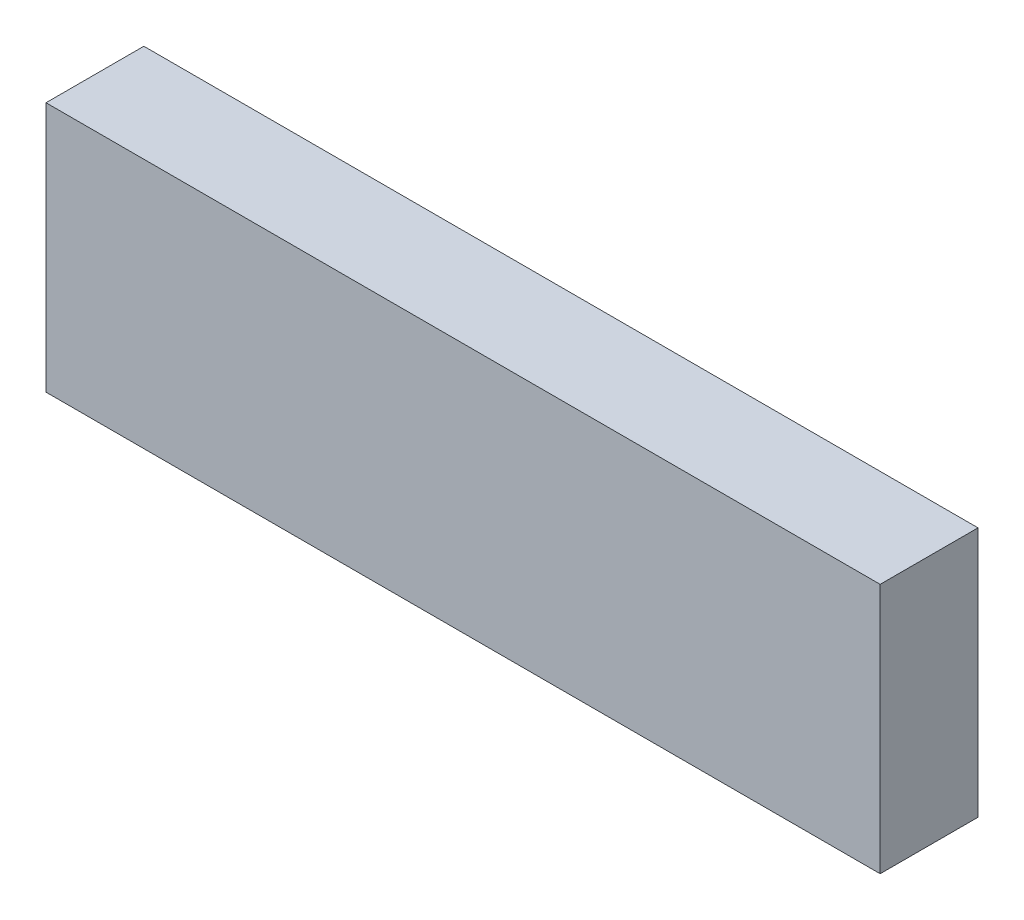
ISO-10303-21;
HEADER;
FILE_DESCRIPTION(('STEP AP214'),'2;1');
FILE_NAME('part.step','',(''),(''),'','','');
FILE_SCHEMA(('AUTOMOTIVE_DESIGN { 1 0 10303 214 1 1 1 1 }'));
ENDSEC;
DATA;
#1=APPLICATION_CONTEXT('core data for automotive mechanical design processes');
#2=APPLICATION_PROTOCOL_DEFINITION('international standard','automotive_design',2000,#1);
#3=PRODUCT_CONTEXT('',#1,'mechanical');
#4=PRODUCT('Part','Part','',(#3));
#5=PRODUCT_RELATED_PRODUCT_CATEGORY('part','',(#4));
#6=PRODUCT_DEFINITION_FORMATION('','',#4);
#7=PRODUCT_DEFINITION_CONTEXT('part definition',#1,'design');
#8=PRODUCT_DEFINITION('design','',#6,#7);
#9=PRODUCT_DEFINITION_SHAPE('','',#8);
#10=(LENGTH_UNIT() NAMED_UNIT(*) SI_UNIT(.MILLI.,.METRE.));
#11=(NAMED_UNIT(*) PLANE_ANGLE_UNIT() SI_UNIT($,.RADIAN.));
#12=(NAMED_UNIT(*) SI_UNIT($,.STERADIAN.) SOLID_ANGLE_UNIT());
#13=UNCERTAINTY_MEASURE_WITH_UNIT(LENGTH_MEASURE(1.E-05),#10,'distance_accuracy_value','');
#14=(GEOMETRIC_REPRESENTATION_CONTEXT(3) GLOBAL_UNCERTAINTY_ASSIGNED_CONTEXT((#13)) GLOBAL_UNIT_ASSIGNED_CONTEXT((#10,
#11,#12)) REPRESENTATION_CONTEXT('',''));
#15=CARTESIAN_POINT('',(0.,0.,0.));
#16=DIRECTION('',(0.,0.,1.));
#17=DIRECTION('',(1.,0.,0.));
#18=AXIS2_PLACEMENT_3D('',#15,#16,#17);
#19=CARTESIAN_POINT('',(-20.3,12.2,4.7625));
#20=DIRECTION('',(1.,0.,0.));
#21=DIRECTION('',(0.,0.,-1.));
#22=AXIS2_PLACEMENT_3D('',#19,#20,#21);
#23=PLANE('',#22);
#24=DIRECTION('',(0.,-1.,0.));
#25=VECTOR('',#24,1.);
#26=CARTESIAN_POINT('',(-20.3,12.2,0.));
#27=LINE('',#26,#25);
#28=CARTESIAN_POINT('',(-20.3,12.2,0.));
#29=VERTEX_POINT('',#28);
#30=CARTESIAN_POINT('',(-20.3,0.,0.));
#31=VERTEX_POINT('',#30);
#32=EDGE_CURVE('E96',#29,#31,#27,.T.);
#33=ORIENTED_EDGE('',*,*,#32,.T.);
#34=DIRECTION('',(0.,0.,-1.));
#35=VECTOR('',#34,1.);
#36=CARTESIAN_POINT('',(-20.3,0.,4.7625));
#37=LINE('',#36,#35);
#38=CARTESIAN_POINT('',(-20.3,0.,4.7625));
#39=VERTEX_POINT('',#38);
#40=EDGE_CURVE('E11',#39,#31,#37,.T.);
#41=ORIENTED_EDGE('',*,*,#40,.F.);
#42=DIRECTION('',(0.,-1.,0.));
#43=VECTOR('',#42,1.);
#44=CARTESIAN_POINT('',(-20.3,12.2,4.7625));
#45=LINE('',#44,#43);
#46=CARTESIAN_POINT('',(-20.3,12.2,4.7625));
#47=VERTEX_POINT('',#46);
#48=EDGE_CURVE('E84',#47,#39,#45,.T.);
#49=ORIENTED_EDGE('',*,*,#48,.F.);
#50=DIRECTION('',(0.,0.,-1.));
#51=VECTOR('',#50,1.);
#52=CARTESIAN_POINT('',(-20.3,12.2,4.7625));
#53=LINE('',#52,#51);
#54=EDGE_CURVE('E92',#47,#29,#53,.T.);
#55=ORIENTED_EDGE('',*,*,#54,.T.);
#56=EDGE_LOOP('',(#33,#41,#49,#55));
#57=FACE_BOUND('',#56,.T.);
#58=ADVANCED_FACE('F33',(#57),#23,.F.);
#59=CARTESIAN_POINT('',(-20.3,0.,4.7625));
#60=DIRECTION('',(0.,1.,0.));
#61=DIRECTION('',(-1.,0.,0.));
#62=AXIS2_PLACEMENT_3D('',#59,#60,#61);
#63=PLANE('',#62);
#64=DIRECTION('',(1.,0.,0.));
#65=VECTOR('',#64,1.);
#66=CARTESIAN_POINT('',(-20.3,0.,0.));
#67=LINE('',#66,#65);
#68=CARTESIAN_POINT('',(20.3,0.,0.));
#69=VERTEX_POINT('',#68);
#70=EDGE_CURVE('E88',#31,#69,#67,.T.);
#71=ORIENTED_EDGE('',*,*,#70,.T.);
#72=DIRECTION('',(0.,0.,-1.));
#73=VECTOR('',#72,1.);
#74=CARTESIAN_POINT('',(20.3,0.,4.7625));
#75=LINE('',#74,#73);
#76=CARTESIAN_POINT('',(20.3,0.,4.7625));
#77=VERTEX_POINT('',#76);
#78=EDGE_CURVE('E41',#77,#69,#75,.T.);
#79=ORIENTED_EDGE('',*,*,#78,.F.);
#80=DIRECTION('',(1.,0.,0.));
#81=VECTOR('',#80,1.);
#82=CARTESIAN_POINT('',(-20.3,0.,4.7625));
#83=LINE('',#82,#81);
#84=EDGE_CURVE('E79',#39,#77,#83,.T.);
#85=ORIENTED_EDGE('',*,*,#84,.F.);
#86=ORIENTED_EDGE('',*,*,#40,.T.);
#87=EDGE_LOOP('',(#71,#79,#85,#86));
#88=FACE_BOUND('',#87,.T.);
#89=ADVANCED_FACE('F87',(#88),#63,.F.);
#90=CARTESIAN_POINT('',(20.3,0.,4.7625));
#91=DIRECTION('',(-1.,0.,0.));
#92=DIRECTION('',(0.,0.,1.));
#93=AXIS2_PLACEMENT_3D('',#90,#91,#92);
#94=PLANE('',#93);
#95=DIRECTION('',(0.,1.,0.));
#96=VECTOR('',#95,1.);
#97=CARTESIAN_POINT('',(20.3,0.,0.));
#98=LINE('',#97,#96);
#99=CARTESIAN_POINT('',(20.3,12.2,0.));
#100=VERTEX_POINT('',#99);
#101=EDGE_CURVE('E66',#69,#100,#98,.T.);
#102=ORIENTED_EDGE('',*,*,#101,.T.);
#103=DIRECTION('',(0.,0.,-1.));
#104=VECTOR('',#103,1.);
#105=CARTESIAN_POINT('',(20.3,12.2,4.7625));
#106=LINE('',#105,#104);
#107=CARTESIAN_POINT('',(20.3,12.2,4.7625));
#108=VERTEX_POINT('',#107);
#109=EDGE_CURVE('E89',#108,#100,#106,.T.);
#110=ORIENTED_EDGE('',*,*,#109,.F.);
#111=DIRECTION('',(0.,1.,0.));
#112=VECTOR('',#111,1.);
#113=CARTESIAN_POINT('',(20.3,0.,4.7625));
#114=LINE('',#113,#112);
#115=EDGE_CURVE('E82',#77,#108,#114,.T.);
#116=ORIENTED_EDGE('',*,*,#115,.F.);
#117=ORIENTED_EDGE('',*,*,#78,.T.);
#118=EDGE_LOOP('',(#102,#110,#116,#117));
#119=FACE_BOUND('',#118,.T.);
#120=ADVANCED_FACE('F90',(#119),#94,.F.);
#121=CARTESIAN_POINT('',(20.3,12.2,4.7625));
#122=DIRECTION('',(0.,-1.,0.));
#123=DIRECTION('',(0.,0.,-1.));
#124=AXIS2_PLACEMENT_3D('',#121,#122,#123);
#125=PLANE('',#124);
#126=DIRECTION('',(-1.,0.,0.));
#127=VECTOR('',#126,1.);
#128=CARTESIAN_POINT('',(20.3,12.2,0.));
#129=LINE('',#128,#127);
#130=EDGE_CURVE('E72',#100,#29,#129,.T.);
#131=ORIENTED_EDGE('',*,*,#130,.T.);
#132=ORIENTED_EDGE('',*,*,#54,.F.);
#133=DIRECTION('',(-1.,0.,0.));
#134=VECTOR('',#133,1.);
#135=CARTESIAN_POINT('',(20.3,12.2,4.7625));
#136=LINE('',#135,#134);
#137=EDGE_CURVE('E49',#108,#47,#136,.T.);
#138=ORIENTED_EDGE('',*,*,#137,.F.);
#139=ORIENTED_EDGE('',*,*,#109,.T.);
#140=EDGE_LOOP('',(#131,#132,#138,#139));
#141=FACE_BOUND('',#140,.T.);
#142=ADVANCED_FACE('F103',(#141),#125,.F.);
#143=CARTESIAN_POINT('',(0.,0.,4.7625));
#144=DIRECTION('',(0.,0.,1.));
#145=DIRECTION('',(1.,0.,0.));
#146=AXIS2_PLACEMENT_3D('',#143,#144,#145);
#147=PLANE('',#146);
#148=ORIENTED_EDGE('',*,*,#48,.T.);
#149=ORIENTED_EDGE('',*,*,#84,.T.);
#150=ORIENTED_EDGE('',*,*,#115,.T.);
#151=ORIENTED_EDGE('',*,*,#137,.T.);
#152=EDGE_LOOP('',(#148,#149,#150,#151));
#153=FACE_BOUND('',#152,.T.);
#154=ADVANCED_FACE('F80',(#153),#147,.T.);
#155=CARTESIAN_POINT('',(0.,0.,0.));
#156=DIRECTION('',(0.,0.,1.));
#157=DIRECTION('',(1.,0.,0.));
#158=AXIS2_PLACEMENT_3D('',#155,#156,#157);
#159=PLANE('',#158);
#160=ORIENTED_EDGE('',*,*,#32,.F.);
#161=ORIENTED_EDGE('',*,*,#130,.F.);
#162=ORIENTED_EDGE('',*,*,#101,.F.);
#163=ORIENTED_EDGE('',*,*,#70,.F.);
#164=EDGE_LOOP('',(#160,#161,#162,#163));
#165=FACE_BOUND('',#164,.T.);
#166=ADVANCED_FACE('F106',(#165),#159,.F.);
#167=CLOSED_SHELL('',(#58,#89,#120,#142,#154,#166));
#168=MANIFOLD_SOLID_BREP('B2',#167);
#169=ADVANCED_BREP_SHAPE_REPRESENTATION('',(#18,#168),#14);
#170=SHAPE_DEFINITION_REPRESENTATION(#9,#169);
ENDSEC;
END-ISO-10303-21;
